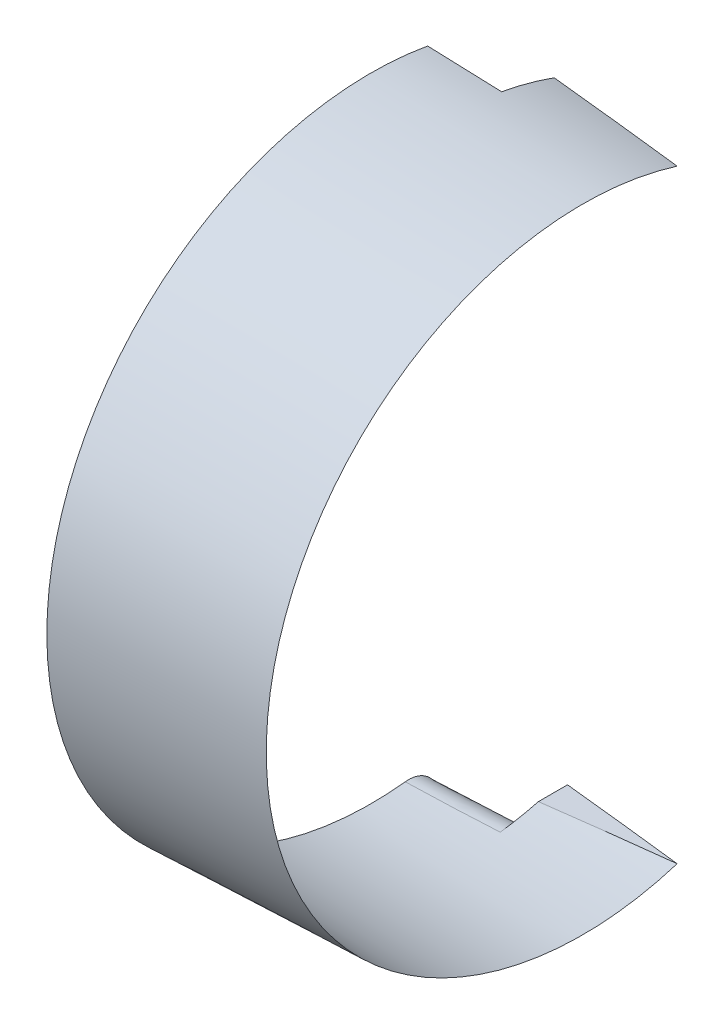
ISO-10303-21;
HEADER;
FILE_DESCRIPTION(('STEP AP214'),'2;1');
FILE_NAME('part.step','',(''),(''),'','','');
FILE_SCHEMA(('AUTOMOTIVE_DESIGN { 1 0 10303 214 1 1 1 1 }'));
ENDSEC;
DATA;
#1=APPLICATION_CONTEXT('core data for automotive mechanical design processes');
#2=APPLICATION_PROTOCOL_DEFINITION('international standard','automotive_design',2000,#1);
#3=PRODUCT_CONTEXT('',#1,'mechanical');
#4=PRODUCT('Part','Part','',(#3));
#5=PRODUCT_RELATED_PRODUCT_CATEGORY('part','',(#4));
#6=PRODUCT_DEFINITION_FORMATION('','',#4);
#7=PRODUCT_DEFINITION_CONTEXT('part definition',#1,'design');
#8=PRODUCT_DEFINITION('design','',#6,#7);
#9=PRODUCT_DEFINITION_SHAPE('','',#8);
#10=(LENGTH_UNIT() NAMED_UNIT(*) SI_UNIT(.MILLI.,.METRE.));
#11=(NAMED_UNIT(*) PLANE_ANGLE_UNIT() SI_UNIT($,.RADIAN.));
#12=(NAMED_UNIT(*) SI_UNIT($,.STERADIAN.) SOLID_ANGLE_UNIT());
#13=UNCERTAINTY_MEASURE_WITH_UNIT(LENGTH_MEASURE(1.E-05),#10,'distance_accuracy_value','');
#14=(GEOMETRIC_REPRESENTATION_CONTEXT(3) GLOBAL_UNCERTAINTY_ASSIGNED_CONTEXT((#13)) GLOBAL_UNIT_ASSIGNED_CONTEXT((#10,
#11,#12)) REPRESENTATION_CONTEXT('',''));
#15=CARTESIAN_POINT('',(0.,0.,0.));
#16=DIRECTION('',(0.,0.,1.));
#17=DIRECTION('',(1.,0.,0.));
#18=AXIS2_PLACEMENT_3D('',#15,#16,#17);
#19=CARTESIAN_POINT('',(-30.4,170.25,10.));
#20=DIRECTION('',(1.,0.,0.));
#21=DIRECTION('',(0.,0.,-1.));
#22=AXIS2_PLACEMENT_3D('',#19,#20,#21);
#23=PLANE('',#22);
#24=CARTESIAN_POINT('',(-30.4,170.25,10.));
#25=DIRECTION('',(1.,0.,0.));
#26=DIRECTION('',(0.,0.,1.));
#27=AXIS2_PLACEMENT_3D('',#24,#25,#26);
#28=CIRCLE('',#27,21.8730192372937);
#29=CARTESIAN_POINT('',(-30.4,191.782634589641,6.15622344769881));
#30=VERTEX_POINT('',#29);
#31=CARTESIAN_POINT('',(-30.4,148.76809032401,5.88216959703025));
#32=VERTEX_POINT('',#31);
#33=EDGE_CURVE('E88',#30,#32,#28,.T.);
#34=ORIENTED_EDGE('',*,*,#33,.F.);
#35=DIRECTION('',(0.,-1.,1.66037818414903E-13));
#36=VECTOR('',#35,1.);
#37=CARTESIAN_POINT('',(-30.4,193.05,6.1562234476986));
#38=LINE('',#37,#36);
#39=CARTESIAN_POINT('',(-30.4,190.76605015339,6.15622344769898));
#40=VERTEX_POINT('',#39);
#41=EDGE_CURVE('E96',#30,#40,#38,.T.);
#42=ORIENTED_EDGE('',*,*,#41,.T.);
#43=CARTESIAN_POINT('',(-30.4,170.25,10.));
#44=DIRECTION('',(-1.,0.,0.));
#45=DIRECTION('',(0.,0.,-1.));
#46=AXIS2_PLACEMENT_3D('',#43,#44,#45);
#47=CIRCLE('',#46,20.8730192372937);
#48=CARTESIAN_POINT('',(-30.4,149.507146212334,7.67256604305121));
#49=VERTEX_POINT('',#48);
#50=EDGE_CURVE('E108',#40,#49,#47,.F.);
#51=ORIENTED_EDGE('',*,*,#50,.T.);
#52=CARTESIAN_POINT('',(-35.1580639980427,149.6491063401,7.90777717509679));
#53=CARTESIAN_POINT('',(-35.2156799137428,149.788160837243,6.55850174038444));
#54=CARTESIAN_POINT('',(-35.2809816004144,148.584928754612,5.93306733864176));
#55=CARTESIAN_POINT('',(-34.5237847408734,149.629558908741,7.88105479625842));
#56=CARTESIAN_POINT('',(-34.5874994506828,149.767014456978,6.56544779082468));
#57=CARTESIAN_POINT('',(-34.6480946916069,148.608653663823,5.92647455663651));
#58=CARTESIAN_POINT('',(-33.8895799767252,149.610225316154,7.85264647986084));
#59=CARTESIAN_POINT('',(-33.9542630724782,149.745937689544,6.57036802592357));
#60=CARTESIAN_POINT('',(-34.0152556415632,148.63238581256,5.91987976287992));
#61=CARTESIAN_POINT('',(-32.6213511889419,149.572076322533,7.79207297152526));
#62=CARTESIAN_POINT('',(-32.6880980547652,149.704318606522,6.57585912091874));
#63=CARTESIAN_POINT('',(-32.7496968528884,148.679863691206,5.90668640137108));
#64=CARTESIAN_POINT('',(-31.9873271703355,149.553260934744,7.75990768367231));
#65=CARTESIAN_POINT('',(-32.054902437266,149.683759857535,6.57649464052017));
#66=CARTESIAN_POINT('',(-32.1169771177165,148.703609421447,5.90008783352674));
#67=CARTESIAN_POINT('',(-30.7196902836956,149.516244727201,7.69144553667454));
#68=CARTESIAN_POINT('',(-30.7890572232617,149.643213098873,6.5733547365916));
#69=CARTESIAN_POINT('',(-30.8518788033661,148.751106123961,5.88688924115863));
#70=CARTESIAN_POINT('',(-30.0860773514408,149.498043747556,7.65514976335643));
#71=CARTESIAN_POINT('',(-30.1561642848294,149.623209446235,6.56964130222848));
#72=CARTESIAN_POINT('',(-30.2195001782344,148.774857093227,5.88028921747081));
#73=CARTESIAN_POINT('',(-28.8191766328052,149.462384203628,7.57783900375499));
#74=CARTESIAN_POINT('',(-28.890822131952,149.583827459632,6.55759962654935));
#75=CARTESIAN_POINT('',(-28.9549857028083,148.822367939212,5.86708669485291));
#76=CARTESIAN_POINT('',(-28.1858888432557,149.44492563197,7.53682406437588));
#77=CARTESIAN_POINT('',(-28.2581457168726,149.564433920545,6.54933066191965));
#78=CARTESIAN_POINT('',(-28.3228498501636,148.846127815841,5.8604841959481));
#79=CARTESIAN_POINT('',(-26.8882348003006,149.410085602469,7.44709841843797));
#80=CARTESIAN_POINT('',(-26.9622679887698,149.525427065125,6.52730380598504));
#81=CARTESIAN_POINT('',(-27.0274562354324,148.894835794832,5.84694900875101));
#82=CARTESIAN_POINT('',(-26.2238899976702,149.39275120218,7.39810634191233));
#83=CARTESIAN_POINT('',(-26.2984390755207,149.505820483017,6.51335305476467));
#84=CARTESIAN_POINT('',(-26.3642149107087,148.919784197709,5.84001623695035));
#85=CARTESIAN_POINT('',(-25.2278354638509,149.367752523261,7.31896973555718));
#86=CARTESIAN_POINT('',(-25.3000426915673,149.477038049908,6.48770379762147));
#87=CARTESIAN_POINT('',(-25.3697108742918,148.957208200431,5.82961669065429));
#88=CARTESIAN_POINT('',(-24.8958720190964,149.359586266819,7.29164741778525));
#89=CARTESIAN_POINT('',(-24.9683449738582,149.467590737138,6.47842125997502));
#90=CARTESIAN_POINT('',(-25.0382468389186,148.969683942728,5.82614987657351));
#91=CARTESIAN_POINT('',(-24.2321507052048,149.343649857605,7.23484398062451));
#92=CARTESIAN_POINT('',(-24.3051502925843,149.448967589032,6.45817384005387));
#93=CARTESIAN_POINT('',(-24.3754838929312,148.99463416338,5.81921659964176));
#94=CARTESIAN_POINT('',(-23.90039283891,149.335879710193,7.2053628320317));
#95=CARTESIAN_POINT('',(-23.9736247959083,149.43978929041,6.44721864310385));
#96=CARTESIAN_POINT('',(-24.0441849846119,149.007108641716,5.81575013679617));
#97=CARTESIAN_POINT('',(-23.5687604403854,149.328338394709,7.17466430722613));
#98=CARTESIAN_POINT('',(-23.6411997201521,149.430735279185,6.43531556588234));
#99=CARTESIAN_POINT('',(-23.7129885556421,149.019581734774,5.81228405889741));
#100=(BOUNDED_SURFACE() B_SPLINE_SURFACE(3,2,((#52,#53,#54),(#55,#56,#57),(#58,#59,#60),(#61,
#62,#63),(#64,#65,#66),(#67,#68,#69),(#70,#71,#72),(#73,#74,#75),(#76,#77,#78),(#79,#80,#81),
(#82,#83,#84),(#85,#86,#87),(#88,#89,#90),(#91,#92,#93),(#94,#95,#96),(#97,#98,#99)),
.UNSPECIFIED.,.F.,.F.,.F.) B_SPLINE_SURFACE_WITH_KNOTS((4,2,2,2,2,2,2,4),(3,3),(0.,
1.90571918967408,3.8114870427278,5.71675505764458,7.62200413756297,9.62204994771057,
10.6222078023356,11.6223791892886),(0.,1.),
.UNSPECIFIED.) GEOMETRIC_REPRESENTATION_ITEM() RATIONAL_B_SPLINE_SURFACE(((1.,0.827379244250776,
1.),(1.,0.833845700558867,1.),(1.,0.840217705577001,1.),(1.,0.852784134376111,1.),(1.,
0.858978553618317,1.),(1.,0.871199200296149,1.),(1.,0.877225471418427,1.),(1.,0.889121306191974,
1.),(1.,0.894990871400044,1.),(1.,0.906870030276326,1.),(1.,0.912872060352,1.),(1.,
0.921759461394651,1.),(1.,0.924702849055032,1.),(1.,0.930551349853959,1.),(1.,0.933456462474104,
1.),(1.,0.936342606354415,1.))) REPRESENTATION_ITEM('') SURFACE());
#101=CARTESIAN_POINT('',(-30.4,148.76809032401,5.88216959703025));
#102=CARTESIAN_POINT('',(-30.4,148.812180430618,5.91755228924468));
#103=CARTESIAN_POINT('',(-30.4,148.854755146266,5.95478004241824));
#104=CARTESIAN_POINT('',(-30.4,148.936616541938,6.03268698333387));
#105=CARTESIAN_POINT('',(-30.4,148.975903358512,6.07336602759837));
#106=CARTESIAN_POINT('',(-30.4,149.08827219552,6.20002471887063));
#107=CARTESIAN_POINT('',(-30.4,149.156075642207,6.29079726591634));
#108=CARTESIAN_POINT('',(-30.4,149.275497352648,6.48246244023975));
#109=CARTESIAN_POINT('',(-30.4,149.327103364908,6.58336265216421));
#110=CARTESIAN_POINT('',(-30.4,149.412670929775,6.79238334433853));
#111=CARTESIAN_POINT('',(-30.4,149.446633277744,6.9005034988711));
#112=CARTESIAN_POINT('',(-30.4,149.495470778788,7.1189742737662));
#113=CARTESIAN_POINT('',(-30.4,149.51067839073,7.22924975142673));
#114=CARTESIAN_POINT('',(-30.4,149.519713832097,7.39538291059224));
#115=CARTESIAN_POINT('',(-30.4,149.520422693815,7.45094325872433));
#116=CARTESIAN_POINT('',(-30.4,149.517235752087,7.56193507232413));
#117=CARTESIAN_POINT('',(-30.4,149.513339673379,7.61736652988895));
#118=CARTESIAN_POINT('',(-30.4,149.507146212334,7.67256604305121));
#119=B_SPLINE_CURVE_WITH_KNOTS('',3,(#101,#102,#103,#104,#105,#106,#107,#108,#109,#110,#111,
#112,#113,#114,#115,#116,#117,#118),.UNSPECIFIED.,.F.,.F.,(4,2,2,2,2,2,2,2,4),(0.,
0.16949195160629,0.338976860517195,0.677136938528227,1.01555218271773,1.35395217009212,
1.68626298146878,1.85279186417179,2.01933070165036),.UNSPECIFIED.);
#120=EDGE_CURVE('E106',#32,#49,#119,.T.);
#121=ORIENTED_EDGE('',*,*,#120,.F.);
#122=EDGE_LOOP('',(#34,#42,#51,#121));
#123=FACE_BOUND('',#122,.T.);
#124=ADVANCED_FACE('F17',(#123),#23,.F.);
#125=CARTESIAN_POINT('',(-25.,190.65,757.817890449207));
#126=DIRECTION('',(0.,1.,0.));
#127=DIRECTION('',(0.,0.,-1.));
#128=AXIS2_PLACEMENT_3D('',#125,#126,#127);
#129=PLANE('',#128);
#130=DIRECTION('',(0.,0.,-1.));
#131=VECTOR('',#130,1.);
#132=CARTESIAN_POINT('',(-25.4,190.65,757.817890449207));
#133=LINE('',#132,#131);
#134=CARTESIAN_POINT('',(-25.4,190.65,4.81903121821762));
#135=VERTEX_POINT('',#134);
#136=CARTESIAN_POINT('',(-25.4,190.65,2.60667663159342));
#137=VERTEX_POINT('',#136);
#138=EDGE_CURVE('E137',#135,#137,#133,.T.);
#139=ORIENTED_EDGE('',*,*,#138,.T.);
#140=CARTESIAN_POINT('',(-62.8082811067893,190.65,-0.632879414674593));
#141=CARTESIAN_POINT('',(-61.3386385128492,190.65,-0.521838131036973));
#142=CARTESIAN_POINT('',(-59.869097676116,190.65,-0.409449074674919));
#143=CARTESIAN_POINT('',(-56.9302474357948,190.65,-0.18167268701923));
#144=CARTESIAN_POINT('',(-55.4609380323724,190.65,-0.0662853535906007));
#145=CARTESIAN_POINT('',(-51.053815742654,190.65,0.2847949569871));
#146=CARTESIAN_POINT('',(-48.1163948766174,190.65,0.525437345784025));
#147=CARTESIAN_POINT('',(-42.2456558523834,190.65,1.02294366032289));
#148=CARTESIAN_POINT('',(-39.3123364138391,190.65,1.27979235866845));
#149=CARTESIAN_POINT('',(-34.9136102399035,190.65,1.68109526654585));
#150=CARTESIAN_POINT('',(-33.4474727149579,190.65,1.81754482732303));
#151=CARTESIAN_POINT('',(-30.5157755952489,190.65,2.09666245593361));
#152=CARTESIAN_POINT('',(-29.0502160054168,190.65,2.23933057571735));
#153=CARTESIAN_POINT('',(-26.1176709337122,190.65,2.53218223708271));
#154=CARTESIAN_POINT('',(-24.650686521203,190.65,2.68237651434194));
#155=CARTESIAN_POINT('',(-21.717678932816,190.65,2.99152759042302));
#156=CARTESIAN_POINT('',(-20.2516557311842,190.65,3.15048414388201));
#157=CARTESIAN_POINT('',(-17.3213387654425,190.65,3.4790812854021));
#158=CARTESIAN_POINT('',(-15.857044568226,190.65,3.64871799849608));
#159=CARTESIAN_POINT('',(-12.9299237830079,190.65,4.00152449878683));
#160=CARTESIAN_POINT('',(-11.4670973542034,190.65,4.18469562065548));
#161=CARTESIAN_POINT('',(-9.27370509401195,190.65,4.47295021685582));
#162=CARTESIAN_POINT('',(-8.54226032736779,190.65,4.57135022665871));
#163=CARTESIAN_POINT('',(-7.08010714679224,190.65,4.7734151606506));
#164=CARTESIAN_POINT('',(-6.34939872168463,190.65,4.87708000366372));
#165=CARTESIAN_POINT('',(-4.88910004395575,190.65,5.09064694973913));
#166=CARTESIAN_POINT('',(-4.15950953541669,190.65,5.20054729720178));
#167=CARTESIAN_POINT('',(-2.70147090297682,190.65,5.42798435006328));
#168=CARTESIAN_POINT('',(-1.97302284574464,190.65,5.54552148528854));
#169=CARTESIAN_POINT('',(-0.516769503285837,190.65,5.7903275253578));
#170=CARTESIAN_POINT('',(0.211033668998,190.65,5.91760905383816));
#171=CARTESIAN_POINT('',(1.66427328905573,190.65,6.18461411370408));
#172=CARTESIAN_POINT('',(2.38971008100049,190.65,6.32433574372698));
#173=CARTESIAN_POINT('',(3.47557792907779,190.65,6.54691410495799));
#174=CARTESIAN_POINT('',(3.8373311928785,190.65,6.62331392739027));
#175=CARTESIAN_POINT('',(4.55966621000204,190.65,6.78138533566997));
#176=CARTESIAN_POINT('',(4.92024802927615,190.65,6.86305661914088));
#177=CARTESIAN_POINT('',(5.64008586490631,190.65,7.03291398892278));
#178=CARTESIAN_POINT('',(5.99934111267151,190.65,7.12110337139022));
#179=CARTESIAN_POINT('',(6.7157046170183,190.65,7.30605389981151));
#180=CARTESIAN_POINT('',(7.07281243790749,190.65,7.40281672647657));
#181=CARTESIAN_POINT('',(7.42845753958506,190.65,7.50489636178006));
#182=B_SPLINE_CURVE_WITH_KNOTS('',3,(#140,#141,#142,#143,#144,#145,#146,#147,#148,#149,#150,
#151,#152,#153,#154,#155,#156,#157,#158,#159,#160,#161,#162,#163,#164,#165,#166,#167,#168,#169,
#170,#171,#172,#173,#174,#175,#176,#177,#178,#179,#180,#181),.UNSPECIFIED.,.F.,.F.,(4,2,2,2,2,2,
2,2,2,2,2,2,2,2,2,2,2,2,2,2,4),(0.,4.42149392257532,8.8429909936661,17.6847399449881,
26.5183014855311,30.9357110578034,35.3531575405593,39.7770953657568,44.2009093738987,
48.6231274850162,53.045782268892,55.2598690348606,57.4739216732695,59.6873540113512,
61.9009110376157,64.1173858469945,66.3335224668844,67.4426896258096,68.5517932181928,
69.6614615652571,70.771347931592),.UNSPECIFIED.);
#183=CARTESIAN_POINT('',(-16.0818800189067,190.650000443993,3.62458368396145));
#184=VERTEX_POINT('',#183);
#185=EDGE_CURVE('E120',#137,#184,#182,.T.);
#186=ORIENTED_EDGE('',*,*,#185,.T.);
#187=CARTESIAN_POINT('',(10.1181525308279,190.65,1.02266959439106));
#188=CARTESIAN_POINT('',(9.34778439153069,190.65,1.08946034541119));
#189=CARTESIAN_POINT('',(8.57746954508265,190.65,1.15686744882721));
#190=CARTESIAN_POINT('',(7.03655691914136,190.65,1.29304433133244));
#191=CARTESIAN_POINT('',(6.26595920063214,190.65,1.36181480032713));
#192=CARTESIAN_POINT('',(4.72112752575067,190.65,1.50111862239613));
#193=CARTESIAN_POINT('',(3.94689419726085,190.65,1.57165894662262));
#194=CARTESIAN_POINT('',(2.39896913756692,190.65,1.71425317198982));
#195=CARTESIAN_POINT('',(1.62527733275723,190.65,1.78630627510938));
#196=CARTESIAN_POINT('',(-0.919259386082226,190.65,2.02604357221745));
#197=CARTESIAN_POINT('',(-2.68977328594326,190.65,2.19726438579481));
#198=CARTESIAN_POINT('',(-6.22999124363841,190.65,2.55031336395147));
#199=CARTESIAN_POINT('',(-7.99969515812252,190.65,2.73214297175663));
#200=CARTESIAN_POINT('',(-11.5439661235383,190.65,3.10965629530979));
#201=CARTESIAN_POINT('',(-13.3185282124932,190.65,3.30538677640734));
#202=CARTESIAN_POINT('',(-16.8646995117104,190.65,3.71380712456859));
#203=CARTESIAN_POINT('',(-18.6363098284841,190.65,3.92648726256095));
#204=CARTESIAN_POINT('',(-21.2851643048272,190.65,4.26212343026073));
#205=CARTESIAN_POINT('',(-22.1635175916068,190.65,4.37632743371009));
#206=CARTESIAN_POINT('',(-23.9193628685315,190.65,4.61162458040365));
#207=CARTESIAN_POINT('',(-24.7968547994827,190.65,4.73271816742528));
#208=CARTESIAN_POINT('',(-26.5525180507052,190.65,4.98355858672839));
#209=CARTESIAN_POINT('',(-27.4306868198942,190.65,5.11332334641799));
#210=CARTESIAN_POINT('',(-29.1852141375444,190.65,5.38339996284615));
#211=CARTESIAN_POINT('',(-30.0615730461403,190.65,5.52370946018645));
#212=CARTESIAN_POINT('',(-31.8046538382217,190.65,5.81693623526627));
#213=CARTESIAN_POINT('',(-32.6713950205198,190.65,5.96973825113041));
#214=CARTESIAN_POINT('',(-34.4021883194008,190.65,6.29408587740216));
#215=CARTESIAN_POINT('',(-35.2662376261856,190.65,6.46564685352738));
#216=CARTESIAN_POINT('',(-36.5561028083285,190.65,6.74378491100842));
#217=CARTESIAN_POINT('',(-36.9841998012542,190.65,6.83975780562557));
#218=CARTESIAN_POINT('',(-37.8383817269235,190.65,7.04083295951572));
#219=CARTESIAN_POINT('',(-38.2644661493874,190.65,7.14593741547534));
#220=CARTESIAN_POINT('',(-39.1128058011184,190.65,7.36826058022714));
#221=CARTESIAN_POINT('',(-39.5350657276098,190.65,7.48546130677287));
#222=CARTESIAN_POINT('',(-40.3743013617468,190.65,7.73734074077072));
#223=CARTESIAN_POINT('',(-40.7912799058827,190.65,7.87200958811293));
#224=CARTESIAN_POINT('',(-41.2868839092547,190.65,8.0513085907383));
#225=CARTESIAN_POINT('',(-41.370470100203,190.65,8.08221853787228));
#226=CARTESIAN_POINT('',(-41.5371244693648,190.65,8.14542621503385));
#227=CARTESIAN_POINT('',(-41.6201925932989,190.65,8.17772408777127));
#228=CARTESIAN_POINT('',(-41.8686229908223,190.65,8.27700975395232));
#229=CARTESIAN_POINT('',(-42.0330691409135,190.65,8.34633888419922));
#230=CARTESIAN_POINT('',(-42.3573379458009,190.65,8.4929654090665));
#231=CARTESIAN_POINT('',(-42.5171805224506,190.65,8.57021851368726));
#232=CARTESIAN_POINT('',(-42.8306602160068,190.65,8.73632645703956));
#233=CARTESIAN_POINT('',(-42.9843070441684,190.65,8.82516213580737));
#234=CARTESIAN_POINT('',(-43.2196336345816,190.65,8.98110801214523));
#235=CARTESIAN_POINT('',(-43.3051630078076,190.65,9.04235490475169));
#236=CARTESIAN_POINT('',(-43.4693973045478,190.65,9.17359177784879));
#237=CARTESIAN_POINT('',(-43.548109933499,190.65,9.24357166241894));
#238=CARTESIAN_POINT('',(-43.6632389521219,190.65,9.36421557698408));
#239=CARTESIAN_POINT('',(-43.7037187613086,190.65,9.41095629577337));
#240=CARTESIAN_POINT('',(-43.7782641498711,190.65,9.509365526883));
#241=CARTESIAN_POINT('',(-43.8123384541942,190.65,9.56102718962684));
#242=CARTESIAN_POINT('',(-43.8635730121918,190.65,9.65593938355105));
#243=CARTESIAN_POINT('',(-43.8828318853962,190.65,9.69803855783283));
#244=CARTESIAN_POINT('',(-43.9143076657574,190.65,9.78479425674002));
#245=CARTESIAN_POINT('',(-43.9265360851591,190.65,9.82944646820247));
#246=CARTESIAN_POINT('',(-43.9425592849577,190.65,9.92073128591668));
#247=CARTESIAN_POINT('',(-43.946273067782,190.65,9.96737864655458));
#248=CARTESIAN_POINT('',(-43.9444515545431,190.65,10.0604999260674));
#249=CARTESIAN_POINT('',(-43.9389141855011,190.65,10.1069738037298));
#250=CARTESIAN_POINT('',(-43.9206752025029,190.65,10.1922420324433));
#251=CARTESIAN_POINT('',(-43.9089754005753,190.65,10.2312608311549));
#252=CARTESIAN_POINT('',(-43.8802553308426,190.65,10.3072558523469));
#253=CARTESIAN_POINT('',(-43.8632333678806,190.65,10.3442314196179));
#254=CARTESIAN_POINT('',(-43.8099084619183,190.65,10.4442198251817));
#255=CARTESIAN_POINT('',(-43.7689908235019,190.65,10.504751745004));
#256=CARTESIAN_POINT('',(-43.678760252456,190.65,10.6192079685067));
#257=CARTESIAN_POINT('',(-43.6294157251221,190.65,10.6731060412535));
#258=CARTESIAN_POINT('',(-43.5066854201197,190.65,10.7939132917044));
#259=CARTESIAN_POINT('',(-43.4310480190042,190.65,10.8585029452347));
#260=CARTESIAN_POINT('',(-43.2739753973514,190.65,10.9802980532575));
#261=CARTESIAN_POINT('',(-43.1925279314711,190.65,11.0374871515217));
#262=CARTESIAN_POINT('',(-42.9420123854848,190.65,11.2012635334481));
#263=CARTESIAN_POINT('',(-42.7674978657285,190.65,11.2994337761119));
#264=CARTESIAN_POINT('',(-42.4049712792693,190.65,11.4854454532404));
#265=CARTESIAN_POINT('',(-42.2166982833049,190.65,11.5727508779499));
#266=CARTESIAN_POINT('',(-41.8357348245321,190.65,11.737247704599));
#267=CARTESIAN_POINT('',(-41.6430427230958,190.65,11.8144352811388));
#268=CARTESIAN_POINT('',(-41.0599386336693,190.65,12.0354884580575));
#269=CARTESIAN_POINT('',(-40.6654288230063,190.65,12.1684102389868));
#270=CARTESIAN_POINT('',(-39.8706425455229,190.65,12.4167924201908));
#271=CARTESIAN_POINT('',(-39.4703597763415,190.65,12.5322318579584));
#272=CARTESIAN_POINT('',(-38.6670873958008,190.65,12.7506735932054));
#273=CARTESIAN_POINT('',(-38.2641028233713,190.65,12.853694527553));
#274=CARTESIAN_POINT('',(-37.4601783376116,190.65,13.0496941929844));
#275=CARTESIAN_POINT('',(-37.0592609608059,190.65,13.142766486502));
#276=CARTESIAN_POINT('',(-36.255882610136,190.65,13.322021491904));
#277=CARTESIAN_POINT('',(-35.8534215814388,190.65,13.4082039566302));
#278=CARTESIAN_POINT('',(-34.6442022024362,190.65,13.6585415883151));
#279=CARTESIAN_POINT('',(-33.8357410429888,190.65,13.8144555432839));
#280=CARTESIAN_POINT('',(-32.2151148259625,190.65,14.111193646942));
#281=CARTESIAN_POINT('',(-31.402946513299,190.65,14.2519996846615));
#282=CARTESIAN_POINT('',(-29.7767859639217,190.65,14.5220959044479));
#283=CARTESIAN_POINT('',(-28.9627939085515,190.65,14.6513871835528));
#284=CARTESIAN_POINT('',(-27.334976817698,190.65,14.9007424626544));
#285=CARTESIAN_POINT('',(-26.5211543589791,190.65,15.020823394562));
#286=CARTESIAN_POINT('',(-24.8924555240898,190.65,15.2537178699879));
#287=CARTESIAN_POINT('',(-24.0775791237586,190.65,15.3665312437787));
#288=CARTESIAN_POINT('',(-21.6326018952729,190.65,15.6958761386299));
#289=CARTESIAN_POINT('',(-20.0012935943197,190.65,15.9034410745902));
#290=CARTESIAN_POINT('',(-16.7702116057473,190.65,16.2971119063462));
#291=CARTESIAN_POINT('',(-15.1704804492335,190.65,16.483571733466));
#292=CARTESIAN_POINT('',(-11.9693522104545,190.65,16.8435893992576));
#293=CARTESIAN_POINT('',(-10.3679549315464,190.65,17.017145483327));
#294=CARTESIAN_POINT('',(-7.16396915585725,190.65,17.3539171655097));
#295=CARTESIAN_POINT('',(-5.5613805856288,190.65,17.5171320612698));
#296=CARTESIAN_POINT('',(-2.35541881956578,190.65,17.8350264494596));
#297=CARTESIAN_POINT('',(-0.752045654624625,190.65,17.9897062543438));
#298=CARTESIAN_POINT('',(2.39560166565168,190.65,18.2862752698416));
#299=CARTESIAN_POINT('',(3.93985123584826,190.65,18.4284263282041));
#300=CARTESIAN_POINT('',(7.02871573417081,190.65,18.706970144653));
#301=CARTESIAN_POINT('',(8.57333061085536,190.65,18.8433634725769));
#302=CARTESIAN_POINT('',(10.1181525308279,190.65,18.9773304056089));
#303=B_SPLINE_CURVE_WITH_KNOTS('',3,(#187,#188,#189,#190,#191,#192,#193,#194,#195,#196,#197,
#198,#199,#200,#201,#202,#203,#204,#205,#206,#207,#208,#209,#210,#211,#212,#213,#214,#215,#216,
#217,#218,#219,#220,#221,#222,#223,#224,#225,#226,#227,#228,#229,#230,#231,#232,#233,#234,#235,
#236,#237,#238,#239,#240,#241,#242,#243,#244,#245,#246,#247,#248,#249,#250,#251,#252,#253,#254,
#255,#256,#257,#258,#259,#260,#261,#262,#263,#264,#265,#266,#267,#268,#269,#270,#271,#272,#273,
#274,#275,#276,#277,#278,#279,#280,#281,#282,#283,#284,#285,#286,#287,#288,#289,#290,#291,#292,
#293,#294,#295,#296,#297,#298,#299,#300,#301,#302),.UNSPECIFIED.,.F.,.F.,(4,2,2,2,2,2,2,2,2,2,2,
2,2,2,2,2,2,2,2,2,2,2,2,2,2,2,2,2,2,2,2,2,2,2,2,2,2,2,2,2,2,2,2,2,2,2,2,2,2,2,2,2,2,2,2,2,2,4),
(0.,2.31977422016381,4.64075389918069,6.97307273110424,9.30419068351168,14.6404846714751,
19.9775063120302,25.3334211889887,30.6862836219685,33.3435026757531,36.0008930826752,
38.6639585536399,41.3264299243155,43.9666333032217,46.6090157427176,47.9251180731346,
49.241537886169,50.5560281598812,51.8697796551636,52.137123230785,52.4044943613966,
52.9396891753207,53.4720406473412,54.0035224156819,54.3187958419287,54.6337081101516,
54.8188537157353,55.0037452773881,55.1421467115918,55.2803208656159,55.4198040767016,
55.5593185470862,55.6810717029798,55.8028636779384,56.0207731059365,56.2395182310446,
56.5371668235697,56.8354624152541,57.4349039162695,58.0571833729559,58.6796974292739,
59.9277948449059,61.177377161834,62.4250602039751,63.6597252683003,64.8944346038074,
67.3642645288266,69.8370228975422,72.309545428201,74.7774078505458,77.2453278867857,
82.1785611918842,87.0101861898928,91.8424669770472,96.6750756122064,101.507507216662,
106.159831289212,110.811693840738),.UNSPECIFIED.);
#304=EDGE_CURVE('E133',#184,#135,#303,.T.);
#305=ORIENTED_EDGE('',*,*,#304,.T.);
#306=EDGE_LOOP('',(#139,#186,#305));
#307=FACE_BOUND('',#306,.T.);
#308=ADVANCED_FACE('F192',(#307),#129,.F.);
#309=CARTESIAN_POINT('',(-30.4,170.25,10.));
#310=DIRECTION('',(-1.,0.,0.));
#311=DIRECTION('',(0.,0.,1.));
#312=AXIS2_PLACEMENT_3D('',#309,#310,#311);
#313=CONICAL_SURFACE('',#312,21.8730192372937,0.0349065850398866);
#314=ORIENTED_EDGE('',*,*,#33,.T.);
#315=CARTESIAN_POINT('',(-24.3998,148.993709267679,5.8194736137228));
#316=CARTESIAN_POINT('',(-25.3998648441575,148.956059864328,5.82993579533581));
#317=CARTESIAN_POINT('',(-26.3999305995709,148.918432958062,5.8403917253602));
#318=CARTESIAN_POINT('',(-28.4000639329042,148.843224139698,5.86129108223173));
#319=CARTESIAN_POINT('',(-29.4001315108242,148.805642227601,5.87173450907886));
#320=CARTESIAN_POINT('',(-30.4002,148.768082812587,5.88217168433738));
#321=B_SPLINE_CURVE_WITH_KNOTS('',3,(#315,#316,#317,#318,#319,#320),.UNSPECIFIED.,.F.,.F.,(4,2,
4),(0.,3.00248391024591,6.00496782047607),.UNSPECIFIED.);
#322=CARTESIAN_POINT('',(-24.4,148.993701738232,5.81947570603851));
#323=VERTEX_POINT('',#322);
#324=EDGE_CURVE('E124',#323,#32,#321,.T.);
#325=ORIENTED_EDGE('',*,*,#324,.F.);
#326=CARTESIAN_POINT('',(-24.4,170.25,10.));
#327=DIRECTION('',(-1.,0.,0.));
#328=DIRECTION('',(0.,0.,-1.));
#329=AXIS2_PLACEMENT_3D('',#326,#327,#328);
#330=CIRCLE('',#329,21.6634946203432);
#331=CARTESIAN_POINT('',(-24.4,149.85,2.70980115733191));
#332=VERTEX_POINT('',#331);
#333=EDGE_CURVE('E245',#332,#323,#330,.T.);
#334=ORIENTED_EDGE('',*,*,#333,.F.);
#335=CARTESIAN_POINT('',(7.42845753958506,149.85,7.50489636178011));
#336=CARTESIAN_POINT('',(7.07281243790746,149.85,7.40281672647674));
#337=CARTESIAN_POINT('',(6.71570461701826,149.85,7.30605389981171));
#338=CARTESIAN_POINT('',(5.99934111267147,149.85,7.12110337139043));
#339=CARTESIAN_POINT('',(5.64008586490628,149.85,7.03291398892295));
#340=CARTESIAN_POINT('',(4.92024802927613,149.85,6.86305661914103));
#341=CARTESIAN_POINT('',(4.55966621000202,149.85,6.78138533567013));
#342=CARTESIAN_POINT('',(3.83733119287848,149.85,6.62331392739044));
#343=CARTESIAN_POINT('',(3.47557792907777,149.85,6.54691410495815));
#344=CARTESIAN_POINT('',(2.38971008100047,149.85,6.32433574372714));
#345=CARTESIAN_POINT('',(1.66427328905572,149.85,6.18461411370422));
#346=CARTESIAN_POINT('',(0.211033668997989,149.85,5.91760905383829));
#347=CARTESIAN_POINT('',(-0.516769503285847,149.85,5.79032752535793));
#348=CARTESIAN_POINT('',(-1.97302284574465,149.85,5.54552148528868));
#349=CARTESIAN_POINT('',(-2.70147090297683,149.85,5.42798435006341));
#350=CARTESIAN_POINT('',(-4.15950953541669,149.85,5.20054729720189));
#351=CARTESIAN_POINT('',(-4.88910004395574,149.85,5.09064694973924));
#352=CARTESIAN_POINT('',(-6.34939872168462,149.85,4.87708000366384));
#353=CARTESIAN_POINT('',(-7.08010714679223,149.85,4.77341516065072));
#354=CARTESIAN_POINT('',(-8.54226032736777,149.85,4.57135022665882));
#355=CARTESIAN_POINT('',(-9.27370509401193,149.85,4.47295021685592));
#356=CARTESIAN_POINT('',(-11.4670973542033,149.85,4.18469562065558));
#357=CARTESIAN_POINT('',(-12.9299237830079,149.85,4.00152449878692));
#358=CARTESIAN_POINT('',(-15.857044568226,149.85,3.64871799849618));
#359=CARTESIAN_POINT('',(-17.3213387654425,149.85,3.47908128540222));
#360=CARTESIAN_POINT('',(-20.2516557311842,149.85,3.15048414388207));
#361=CARTESIAN_POINT('',(-21.7176789328159,149.85,2.99152759042301));
#362=CARTESIAN_POINT('',(-24.6506865212029,149.85,2.68237651434211));
#363=CARTESIAN_POINT('',(-26.1176709337122,149.85,2.53218223708314));
#364=CARTESIAN_POINT('',(-29.0502160054168,149.85,2.23933057571778));
#365=CARTESIAN_POINT('',(-30.5157755952488,149.85,2.09666245593377));
#366=CARTESIAN_POINT('',(-33.4474727149579,149.85,1.817544827323));
#367=CARTESIAN_POINT('',(-34.9136102399035,149.85,1.68109526654589));
#368=CARTESIAN_POINT('',(-39.312336413839,149.85,1.2797923586686));
#369=CARTESIAN_POINT('',(-42.2456558523833,149.85,1.02294366032299));
#370=CARTESIAN_POINT('',(-48.1163948766173,149.85,0.525437345784073));
#371=CARTESIAN_POINT('',(-51.0538157426539,149.85,0.284794956987156));
#372=CARTESIAN_POINT('',(-55.4609380323723,149.85,-0.0662853535905377));
#373=CARTESIAN_POINT('',(-56.9302474357947,149.85,-0.181672687019165));
#374=CARTESIAN_POINT('',(-59.8690976761159,149.85,-0.409449074674868));
#375=CARTESIAN_POINT('',(-61.3386385128491,149.85,-0.521838131036937));
#376=CARTESIAN_POINT('',(-62.8082811067892,149.85,-0.632879414674586));
#377=B_SPLINE_CURVE_WITH_KNOTS('',3,(#335,#336,#337,#338,#339,#340,#341,#342,#343,#344,#345,
#346,#347,#348,#349,#350,#351,#352,#353,#354,#355,#356,#357,#358,#359,#360,#361,#362,#363,#364,
#365,#366,#367,#368,#369,#370,#371,#372,#373,#374,#375,#376),.UNSPECIFIED.,.F.,.F.,(4,2,2,2,2,2,
2,2,2,2,2,2,2,2,2,2,2,2,2,2,4),(0.,1.10988636633487,2.21955471339913,3.32865830578234,
4.43782546470755,6.65396208459745,8.87043689397619,11.0839939202407,13.2974262583225,
15.5114788967313,17.7255656626999,22.1482204465757,26.5704385576932,30.9942525658351,
35.4181903910326,39.8356368737885,44.2530464460608,53.0866079866038,61.9283569379258,
66.3498540090165,70.7713479315918),.UNSPECIFIED.);
#378=CARTESIAN_POINT('',(-16.0818800189067,149.849999334011,3.62458439430303));
#379=VERTEX_POINT('',#378);
#380=EDGE_CURVE('E109',#379,#332,#377,.T.);
#381=ORIENTED_EDGE('',*,*,#380,.F.);
#382=CARTESIAN_POINT('',(-16.0818733585423,170.25,10.));
#383=DIRECTION('',(1.,0.,0.));
#384=DIRECTION('',(0.,0.,1.));
#385=AXIS2_PLACEMENT_3D('',#382,#383,#384);
#386=CIRCLE('',#385,21.3730192372937);
#387=EDGE_CURVE('E116',#184,#379,#386,.T.);
#388=ORIENTED_EDGE('',*,*,#387,.F.);
#389=ORIENTED_EDGE('',*,*,#185,.F.);
#390=CARTESIAN_POINT('',(-25.4,170.25,10.));
#391=DIRECTION('',(1.,0.,0.));
#392=DIRECTION('',(0.,0.,1.));
#393=AXIS2_PLACEMENT_3D('',#390,#391,#392);
#394=CIRCLE('',#393,21.6984153898349);
#395=CARTESIAN_POINT('',(-25.4,191.605247885375,6.15622344769884));
#396=VERTEX_POINT('',#395);
#397=EDGE_CURVE('E90',#137,#396,#394,.T.);
#398=ORIENTED_EDGE('',*,*,#397,.T.);
#399=CARTESIAN_POINT('',(-45.8202713528625,192.329425419893,6.15622344769872));
#400=CARTESIAN_POINT('',(-40.2575349457529,192.132253249335,6.15622344769875));
#401=CARTESIAN_POINT('',(-34.6948015274562,191.93499682873,6.15622344769878));
#402=CARTESIAN_POINT('',(-23.5693406684183,191.540315487426,6.15622344769884));
#403=CARTESIAN_POINT('',(-18.0066132276771,191.342890566727,6.15622344769888));
#404=CARTESIAN_POINT('',(-12.4438887757489,191.145381395982,6.15622344769891));
#405=B_SPLINE_CURVE_WITH_KNOTS('',3,(#399,#400,#401,#402,#403,#404),.UNSPECIFIED.,.F.,.F.,(4,2,
4),(0.,16.6986891283879,33.397378256987),.UNSPECIFIED.);
#406=EDGE_CURVE('E83',#30,#396,#405,.T.);
#407=ORIENTED_EDGE('',*,*,#406,.F.);
#408=EDGE_LOOP('',(#314,#325,#334,#381,#388,#389,#398,#407));
#409=FACE_BOUND('',#408,.T.);
#410=ADVANCED_FACE('F85',(#409),#313,.T.);
#411=CARTESIAN_POINT('',(-30.4,170.25,10.));
#412=DIRECTION('',(1.,0.,0.));
#413=DIRECTION('',(0.,0.,-1.));
#414=AXIS2_PLACEMENT_3D('',#411,#412,#413);
#415=CONICAL_SURFACE('',#414,20.8730192372937,0.0349065850398866);
#416=ORIENTED_EDGE('',*,*,#50,.F.);
#417=CARTESIAN_POINT('',(-44.894341895488,190.250864952127,6.15622344769906));
#418=CARTESIAN_POINT('',(-39.6464118729362,190.437475464337,6.15622344769903));
#419=CARTESIAN_POINT('',(-34.3984788096362,190.624000384888,6.156223447699));
#420=CARTESIAN_POINT('',(-23.9026066016162,190.996879042666,6.15622344769894));
#421=CARTESIAN_POINT('',(-18.6546674568961,191.183232779894,6.15622344769891));
#422=CARTESIAN_POINT('',(-13.4067252714279,191.369500925462,6.15622344769888));
#423=B_SPLINE_CURVE_WITH_KNOTS('',3,(#417,#418,#419,#420,#421,#422),.UNSPECIFIED.,.F.,.F.,(4,2,
4),(0.,15.7537404080988,31.5074808159696),.UNSPECIFIED.);
#424=CARTESIAN_POINT('',(-25.4,190.943666164645,6.15622344769895));
#425=VERTEX_POINT('',#424);
#426=EDGE_CURVE('E99',#40,#425,#423,.T.);
#427=ORIENTED_EDGE('',*,*,#426,.T.);
#428=CARTESIAN_POINT('',(-25.4,170.25,10.));
#429=DIRECTION('',(1.,0.,0.));
#430=DIRECTION('',(0.,0.,1.));
#431=AXIS2_PLACEMENT_3D('',#428,#429,#430);
#432=CIRCLE('',#431,21.0476230847524);
#433=EDGE_CURVE('E258',#135,#425,#432,.T.);
#434=ORIENTED_EDGE('',*,*,#433,.F.);
#435=ORIENTED_EDGE('',*,*,#304,.F.);
#436=ORIENTED_EDGE('',*,*,#387,.T.);
#437=CARTESIAN_POINT('',(10.1181525308279,149.85,18.9773304056089));
#438=CARTESIAN_POINT('',(9.34778439153071,149.85,18.9105396545888));
#439=CARTESIAN_POINT('',(8.57746954508267,149.85,18.8431325511727));
#440=CARTESIAN_POINT('',(7.03655691914136,149.85,18.7069556686675));
#441=CARTESIAN_POINT('',(6.26595920063215,149.85,18.6381851996728));
#442=CARTESIAN_POINT('',(4.72112752575067,149.85,18.4988813776038));
#443=CARTESIAN_POINT('',(3.94689419726085,149.85,18.4283410533773));
#444=CARTESIAN_POINT('',(2.39896913756693,149.85,18.2857468280101));
#445=CARTESIAN_POINT('',(1.62527733275723,149.85,18.2136937248906));
#446=CARTESIAN_POINT('',(-0.919259386082162,149.85,17.9739564277826));
#447=CARTESIAN_POINT('',(-2.68977328594313,149.85,17.8027356142052));
#448=CARTESIAN_POINT('',(-6.22999124363815,149.85,17.4496866360485));
#449=CARTESIAN_POINT('',(-7.9996951581222,149.85,17.2678570282433));
#450=CARTESIAN_POINT('',(-11.543966123538,149.85,16.8903437046902));
#451=CARTESIAN_POINT('',(-13.3185282124929,149.85,16.6946132235926));
#452=CARTESIAN_POINT('',(-16.8646995117101,149.85,16.2861928754313));
#453=CARTESIAN_POINT('',(-18.6363098284838,149.85,16.073512737439));
#454=CARTESIAN_POINT('',(-21.285164304827,149.85,15.7378765697392));
#455=CARTESIAN_POINT('',(-22.1635175916066,149.85,15.6236725662898));
#456=CARTESIAN_POINT('',(-23.9193628685315,149.85,15.3883754195962));
#457=CARTESIAN_POINT('',(-24.7968547994828,149.85,15.2672818325746));
#458=CARTESIAN_POINT('',(-26.5525180507054,149.85,15.0164414132715));
#459=CARTESIAN_POINT('',(-27.4306868198946,149.85,14.8866766535818));
#460=CARTESIAN_POINT('',(-29.1852141375449,149.85,14.6166000371536));
#461=CARTESIAN_POINT('',(-30.0615730461409,149.85,14.4762905398133));
#462=CARTESIAN_POINT('',(-31.8046538382223,149.85,14.1830637647335));
#463=CARTESIAN_POINT('',(-32.6713950205204,149.85,14.0302617488693));
#464=CARTESIAN_POINT('',(-34.4021883194013,149.85,13.7059141225976));
#465=CARTESIAN_POINT('',(-35.2662376261861,149.85,13.5343531464724));
#466=CARTESIAN_POINT('',(-36.556102808329,149.85,13.2562150889913));
#467=CARTESIAN_POINT('',(-36.9841998012546,149.85,13.1602421943742));
#468=CARTESIAN_POINT('',(-37.8383817269239,149.85,12.959167040484));
#469=CARTESIAN_POINT('',(-38.2644661493878,149.85,12.8540625845244));
#470=CARTESIAN_POINT('',(-39.1128058011186,149.85,12.6317394197725));
#471=CARTESIAN_POINT('',(-39.53506572761,149.85,12.5145386932267));
#472=CARTESIAN_POINT('',(-40.3743013617469,149.85,12.2626592592291));
#473=CARTESIAN_POINT('',(-40.7912799058829,149.85,12.1279904118873));
#474=CARTESIAN_POINT('',(-41.2868839092546,149.85,11.9486914092616));
#475=CARTESIAN_POINT('',(-41.3704701002029,149.85,11.9177814621275));
#476=CARTESIAN_POINT('',(-41.5371244693646,149.85,11.8545737849659));
#477=CARTESIAN_POINT('',(-41.6201925932987,149.85,11.8222759122285));
#478=CARTESIAN_POINT('',(-41.868622990822,149.85,11.7229902460475));
#479=CARTESIAN_POINT('',(-42.0330691409133,149.85,11.6536611158006));
#480=CARTESIAN_POINT('',(-42.3573379458006,149.85,11.5070345909332));
#481=CARTESIAN_POINT('',(-42.5171805224502,149.85,11.4297814863123));
#482=CARTESIAN_POINT('',(-42.8306602160065,149.85,11.2636735429603));
#483=CARTESIAN_POINT('',(-42.9843070441684,149.85,11.1748378641929));
#484=CARTESIAN_POINT('',(-43.2196336345812,149.85,11.0188919878548));
#485=CARTESIAN_POINT('',(-43.305163007807,149.85,10.957645095248));
#486=CARTESIAN_POINT('',(-43.4693973045474,149.85,10.8264082221509));
#487=CARTESIAN_POINT('',(-43.548109933499,149.85,10.7564283375811));
#488=CARTESIAN_POINT('',(-43.6632389521217,149.85,10.6357844230157));
#489=CARTESIAN_POINT('',(-43.703718761308,149.85,10.5890437042262));
#490=CARTESIAN_POINT('',(-43.7782641498707,149.85,10.4906344731167));
#491=CARTESIAN_POINT('',(-43.8123384541942,149.85,10.4389728103731));
#492=CARTESIAN_POINT('',(-43.8635730121915,149.85,10.3440606164489));
#493=CARTESIAN_POINT('',(-43.8828318853955,149.85,10.3019614421669));
#494=CARTESIAN_POINT('',(-43.9143076657567,149.85,10.2152057432597));
#495=CARTESIAN_POINT('',(-43.926536085159,149.85,10.1705535317974));
#496=CARTESIAN_POINT('',(-43.9425592849576,149.85,10.0792687140833));
#497=CARTESIAN_POINT('',(-43.9462730677812,149.85,10.0326213534454));
#498=CARTESIAN_POINT('',(-43.9444515545423,149.85,9.9395000739325));
#499=CARTESIAN_POINT('',(-43.9389141855009,149.85,9.89302619627005));
#500=CARTESIAN_POINT('',(-43.9206752025027,149.85,9.80775796755669));
#501=CARTESIAN_POINT('',(-43.9089754005746,149.85,9.76873916884525));
#502=CARTESIAN_POINT('',(-43.8802553308419,149.85,9.69274414765316));
#503=CARTESIAN_POINT('',(-43.8632333678804,149.85,9.65576858038205));
#504=CARTESIAN_POINT('',(-43.8099084619185,149.85,9.55578017481814));
#505=CARTESIAN_POINT('',(-43.7689908235015,149.85,9.49524825499616));
#506=CARTESIAN_POINT('',(-43.6787602524553,149.85,9.38079203149353));
#507=CARTESIAN_POINT('',(-43.6294157251217,149.85,9.32689395874641));
#508=CARTESIAN_POINT('',(-43.5066854201196,149.85,9.20608670829529));
#509=CARTESIAN_POINT('',(-43.4310480190037,149.85,9.14149705476536));
#510=CARTESIAN_POINT('',(-43.2739753973506,149.85,9.01970194674273));
#511=CARTESIAN_POINT('',(-43.1925279314704,149.85,8.96251284847844));
#512=CARTESIAN_POINT('',(-42.9420123854841,149.85,8.79873646655179));
#513=CARTESIAN_POINT('',(-42.7674978657278,149.85,8.7005662238877));
#514=CARTESIAN_POINT('',(-42.4049712792684,149.85,8.51455454675919));
#515=CARTESIAN_POINT('',(-42.2166982833038,149.85,8.4272491220498));
#516=CARTESIAN_POINT('',(-41.8357348245307,149.85,8.26275229540081));
#517=CARTESIAN_POINT('',(-41.6430427230943,149.85,8.18556471886095));
#518=CARTESIAN_POINT('',(-41.0599386336674,149.85,7.96451154194202));
#519=CARTESIAN_POINT('',(-40.665428823004,149.85,7.8315897610127));
#520=CARTESIAN_POINT('',(-39.87064254552,149.85,7.58320757980861));
#521=CARTESIAN_POINT('',(-39.4703597763382,149.85,7.46776814204096));
#522=CARTESIAN_POINT('',(-38.667087395797,149.85,7.24932640679376));
#523=CARTESIAN_POINT('',(-38.2641028233673,149.85,7.14630547244597));
#524=CARTESIAN_POINT('',(-37.460178337607,149.85,6.9503058070145));
#525=CARTESIAN_POINT('',(-37.0592609608009,149.85,6.85723351349699));
#526=CARTESIAN_POINT('',(-36.2558826101305,149.85,6.677978508095));
#527=CARTESIAN_POINT('',(-35.853421581433,149.85,6.59179604336877));
#528=CARTESIAN_POINT('',(-34.6442022024295,149.85,6.3414584116837));
#529=CARTESIAN_POINT('',(-33.8357410429815,149.85,6.18554445671482));
#530=CARTESIAN_POINT('',(-32.2151148259541,149.85,5.88880635305667));
#531=CARTESIAN_POINT('',(-31.40294651329,149.85,5.74800031533712));
#532=CARTESIAN_POINT('',(-29.7767859639115,149.85,5.47790409555058));
#533=CARTESIAN_POINT('',(-28.9627939085406,149.85,5.3486128164456));
#534=CARTESIAN_POINT('',(-27.3349768176859,149.85,5.09925753734394));
#535=CARTESIAN_POINT('',(-26.5211543589664,149.85,4.97917660543621));
#536=CARTESIAN_POINT('',(-24.8924555240759,149.85,4.74628213001023));
#537=CARTESIAN_POINT('',(-24.0775791237442,149.85,4.63346875621946));
#538=CARTESIAN_POINT('',(-21.6326018952567,149.85,4.30412386136805));
#539=CARTESIAN_POINT('',(-20.0012935943025,149.85,4.09655892540767));
#540=CARTESIAN_POINT('',(-16.7702116057304,149.85,3.70288809365181));
#541=CARTESIAN_POINT('',(-15.1704804492182,149.85,3.51642826653227));
#542=CARTESIAN_POINT('',(-11.9693522104423,149.85,3.15641060074114));
#543=CARTESIAN_POINT('',(-10.3679549315357,149.85,2.98285451667191));
#544=CARTESIAN_POINT('',(-7.16396915584958,149.85,2.64608283448958));
#545=CARTESIAN_POINT('',(-5.56138058562265,149.85,2.48286793872973));
#546=CARTESIAN_POINT('',(-2.3554188195627,149.85,2.16497355054016));
#547=CARTESIAN_POINT('',(-0.752045654623078,149.85,2.01029374565602));
#548=CARTESIAN_POINT('',(2.39560166565169,149.85,1.71372473015835));
#549=CARTESIAN_POINT('',(3.93985123584828,149.85,1.57157367179589));
#550=CARTESIAN_POINT('',(7.02871573417083,149.85,1.29302985534705));
#551=CARTESIAN_POINT('',(8.57333061085537,149.85,1.15663652742323));
#552=CARTESIAN_POINT('',(10.1181525308279,149.85,1.02266959439107));
#553=B_SPLINE_CURVE_WITH_KNOTS('',3,(#437,#438,#439,#440,#441,#442,#443,#444,#445,#446,#447,
#448,#449,#450,#451,#452,#453,#454,#455,#456,#457,#458,#459,#460,#461,#462,#463,#464,#465,#466,
#467,#468,#469,#470,#471,#472,#473,#474,#475,#476,#477,#478,#479,#480,#481,#482,#483,#484,#485,
#486,#487,#488,#489,#490,#491,#492,#493,#494,#495,#496,#497,#498,#499,#500,#501,#502,#503,#504,
#505,#506,#507,#508,#509,#510,#511,#512,#513,#514,#515,#516,#517,#518,#519,#520,#521,#522,#523,
#524,#525,#526,#527,#528,#529,#530,#531,#532,#533,#534,#535,#536,#537,#538,#539,#540,#541,#542,
#543,#544,#545,#546,#547,#548,#549,#550,#551,#552),.UNSPECIFIED.,.F.,.F.,(4,2,2,2,2,2,2,2,2,2,2,
2,2,2,2,2,2,2,2,2,2,2,2,2,2,2,2,2,2,2,2,2,2,2,2,2,2,2,2,2,2,2,2,2,2,2,2,2,2,2,2,2,2,2,2,2,2,4),
(0.,2.31977422016381,4.64075389918072,6.97307273110427,9.30419068351169,14.6404846714749,
19.9775063120298,25.3334211889884,30.6862836219682,33.3435026757531,36.0008930826754,
38.6639585536404,41.3264299243162,43.9666333032223,46.6090157427182,47.925118073135,
49.2415378861693,50.5560281598814,51.8697796551636,52.1371232307849,52.4044943613964,
52.9396891753205,53.472040647341,54.0035224156814,54.3187958419284,54.6337081101514,
54.8188537157351,55.0037452773878,55.1421467115915,55.2803208656155,55.4198040767012,
55.5593185470857,55.6810717029793,55.8028636779378,56.0207731059359,56.2395182310441,
56.5371668235692,56.8354624152539,57.4349039162695,58.0571833729562,58.6796974292745,
59.9277948449075,61.1773771618366,62.4250602039786,63.6597252683047,64.8944346038127,
67.3642645288335,69.8370228975511,72.3095454282117,74.7774078505582,77.2453278867999,
82.1785611919018,87.0101861899057,91.8424669770555,96.67507561221,101.507507216661,
106.159831289212,110.811693840737),.UNSPECIFIED.);
#554=CARTESIAN_POINT('',(-24.4,149.85,4.67894226998722));
#555=VERTEX_POINT('',#554);
#556=EDGE_CURVE('E216',#555,#379,#553,.T.);
#557=ORIENTED_EDGE('',*,*,#556,.F.);
#558=CARTESIAN_POINT('',(-24.4,170.25,10.));
#559=DIRECTION('',(-1.,0.,0.));
#560=DIRECTION('',(0.,0.,-1.));
#561=AXIS2_PLACEMENT_3D('',#558,#559,#560);
#562=CIRCLE('',#561,21.0825438542442);
#563=CARTESIAN_POINT('',(-24.4,149.347694237363,7.24913301459897));
#564=VERTEX_POINT('',#563);
#565=EDGE_CURVE('E93',#555,#564,#562,.T.);
#566=ORIENTED_EDGE('',*,*,#565,.T.);
#567=CARTESIAN_POINT('',(-35.1580639980427,149.6491063401,7.90777717509679));
#568=CARTESIAN_POINT('',(-34.5237847408734,149.629558908741,7.88105479625842));
#569=CARTESIAN_POINT('',(-33.8895799767252,149.610225316154,7.85264647986084));
#570=CARTESIAN_POINT('',(-32.6213511889419,149.572076322533,7.79207297152526));
#571=CARTESIAN_POINT('',(-31.9873271703355,149.553260934744,7.75990768367231));
#572=CARTESIAN_POINT('',(-30.7196902836956,149.516244727201,7.69144553667454));
#573=CARTESIAN_POINT('',(-30.0860773514408,149.498043747556,7.65514976335643));
#574=CARTESIAN_POINT('',(-28.8191766328052,149.462384203628,7.57783900375499));
#575=CARTESIAN_POINT('',(-28.1858888432557,149.44492563197,7.53682406437588));
#576=CARTESIAN_POINT('',(-26.8882348003006,149.410085602469,7.44709841843797));
#577=CARTESIAN_POINT('',(-26.2238899976702,149.39275120218,7.39810634191233));
#578=CARTESIAN_POINT('',(-25.2278354638509,149.367752523261,7.31896973555718));
#579=CARTESIAN_POINT('',(-24.8958720190964,149.359586266819,7.29164741778525));
#580=CARTESIAN_POINT('',(-24.2321507052048,149.343649857605,7.23484398062451));
#581=CARTESIAN_POINT('',(-23.90039283891,149.335879710193,7.2053628320317));
#582=CARTESIAN_POINT('',(-23.5687604403854,149.328338394709,7.17466430722613));
#583=B_SPLINE_CURVE_WITH_KNOTS('',3,(#567,#568,#569,#570,#571,#572,#573,#574,#575,#576,#577,
#578,#579,#580,#581,#582),.UNSPECIFIED.,.F.,.F.,(4,2,2,2,2,2,2,4),(0.,1.90571918967408,
3.8114870427278,5.71675505764458,7.62200413756297,9.62204994771057,10.6222078023356,
11.6223791892886),.UNSPECIFIED.);
#584=EDGE_CURVE('E31',#49,#564,#583,.T.);
#585=ORIENTED_EDGE('',*,*,#584,.F.);
#586=EDGE_LOOP('',(#416,#427,#434,#435,#436,#557,#566,#585));
#587=FACE_BOUND('',#586,.T.);
#588=ADVANCED_FACE('F155',(#587),#415,.F.);
#589=CARTESIAN_POINT('',(-30.4,149.85,757.817890449207));
#590=DIRECTION('',(0.,-1.,0.));
#591=DIRECTION('',(0.,0.,1.));
#592=AXIS2_PLACEMENT_3D('',#589,#590,#591);
#593=PLANE('',#592);
#594=ORIENTED_EDGE('',*,*,#556,.T.);
#595=ORIENTED_EDGE('',*,*,#380,.T.);
#596=DIRECTION('',(0.,0.,-1.));
#597=VECTOR('',#596,1.);
#598=CARTESIAN_POINT('',(-24.4,149.85,757.817890449207));
#599=LINE('',#598,#597);
#600=EDGE_CURVE('E217',#555,#332,#599,.T.);
#601=ORIENTED_EDGE('',*,*,#600,.F.);
#602=EDGE_LOOP('',(#594,#595,#601));
#603=FACE_BOUND('',#602,.T.);
#604=ADVANCED_FACE('F158',(#603),#593,.F.);
#605=CARTESIAN_POINT('',(-24.4,190.5,0.));
#606=DIRECTION('',(1.,0.,0.));
#607=DIRECTION('',(0.,0.,-1.));
#608=AXIS2_PLACEMENT_3D('',#605,#606,#607);
#609=PLANE('',#608);
#610=ORIENTED_EDGE('',*,*,#600,.T.);
#611=ORIENTED_EDGE('',*,*,#333,.T.);
#612=CARTESIAN_POINT('',(-24.4,149.347694237363,7.24913301459897));
#613=CARTESIAN_POINT('',(-24.4,149.356084008547,7.18546799208814));
#614=CARTESIAN_POINT('',(-24.4,149.36141048539,7.12140088490972));
#615=CARTESIAN_POINT('',(-24.4,149.365937988643,6.9930585714816));
#616=CARTESIAN_POINT('',(-24.4,149.365139809422,6.92878339329966));
#617=CARTESIAN_POINT('',(-24.4,149.357551538197,6.80276678714616));
#618=CARTESIAN_POINT('',(-24.4,149.350964542266,6.74101304656472));
#619=CARTESIAN_POINT('',(-24.4,149.332129889911,6.61837830852752));
#620=CARTESIAN_POINT('',(-24.4,149.319882579267,6.5574972579944));
#621=CARTESIAN_POINT('',(-24.4,149.289987395637,6.43769060311839));
#622=CARTESIAN_POINT('',(-24.4,149.272391908722,6.37875192003929));
#623=CARTESIAN_POINT('',(-24.4,149.231895422817,6.26272378823407));
#624=CARTESIAN_POINT('',(-24.4,149.208994207141,6.20563441514286));
#625=CARTESIAN_POINT('',(-24.4,149.157198322173,6.09184604402333));
#626=CARTESIAN_POINT('',(-24.4,149.128123740553,6.03522885403545));
#627=CARTESIAN_POINT('',(-24.4,149.06475898188,5.92498211572845));
#628=CARTESIAN_POINT('',(-24.4,149.030468058231,5.87135299658553));
#629=CARTESIAN_POINT('',(-24.4,148.993701738232,5.81947570603851));
#630=B_SPLINE_CURVE_WITH_KNOTS('',3,(#612,#613,#614,#615,#616,#617,#618,#619,#620,#621,#622,
#623,#624,#625,#626,#627,#628,#629),.UNSPECIFIED.,.F.,.F.,(4,2,2,2,2,2,2,2,4),(0.,
0.19257163270171,0.385118289234784,0.571167775071253,0.757205896877018,0.941477468648379,
1.12575656745067,1.31640985281912,1.50709045147343),.UNSPECIFIED.);
#631=EDGE_CURVE('E11',#564,#323,#630,.T.);
#632=ORIENTED_EDGE('',*,*,#631,.F.);
#633=ORIENTED_EDGE('',*,*,#565,.F.);
#634=EDGE_LOOP('',(#610,#611,#632,#633));
#635=FACE_BOUND('',#634,.T.);
#636=ADVANCED_FACE('F187',(#635),#609,.F.);
#637=CARTESIAN_POINT('',(-25.4,193.05,6.1562234476986));
#638=DIRECTION('',(0.,1.66037818414903E-13,1.));
#639=DIRECTION('',(0.,1.,-1.66037818414903E-13));
#640=AXIS2_PLACEMENT_3D('',#637,#638,#639);
#641=PLANE('',#640);
#642=ORIENTED_EDGE('',*,*,#41,.F.);
#643=ORIENTED_EDGE('',*,*,#406,.T.);
#644=DIRECTION('',(0.,-1.,1.66037818414903E-13));
#645=VECTOR('',#644,1.);
#646=CARTESIAN_POINT('',(-25.4,193.05,6.1562234476986));
#647=LINE('',#646,#645);
#648=EDGE_CURVE('E103',#425,#396,#647,.F.);
#649=ORIENTED_EDGE('',*,*,#648,.F.);
#650=ORIENTED_EDGE('',*,*,#426,.F.);
#651=EDGE_LOOP('',(#642,#643,#649,#650));
#652=FACE_BOUND('',#651,.T.);
#653=ADVANCED_FACE('F97',(#652),#641,.F.);
#654=CARTESIAN_POINT('',(-25.4,190.5,0.));
#655=DIRECTION('',(-1.,0.,0.));
#656=DIRECTION('',(0.,0.,1.));
#657=AXIS2_PLACEMENT_3D('',#654,#655,#656);
#658=PLANE('',#657);
#659=ORIENTED_EDGE('',*,*,#397,.F.);
#660=ORIENTED_EDGE('',*,*,#138,.F.);
#661=ORIENTED_EDGE('',*,*,#433,.T.);
#662=ORIENTED_EDGE('',*,*,#648,.T.);
#663=EDGE_LOOP('',(#659,#660,#661,#662));
#664=FACE_BOUND('',#663,.T.);
#665=ADVANCED_FACE('F172',(#664),#658,.T.);
#666=ORIENTED_EDGE('',*,*,#631,.T.);
#667=ORIENTED_EDGE('',*,*,#324,.T.);
#668=ORIENTED_EDGE('',*,*,#120,.T.);
#669=ORIENTED_EDGE('',*,*,#584,.T.);
#670=EDGE_LOOP('',(#666,#667,#668,#669));
#671=FACE_BOUND('',#670,.T.);
#672=ADVANCED_FACE('F168',(#671),#100,.T.);
#673=CLOSED_SHELL('',(#124,#308,#410,#588,#604,#636,#653,#665,#672));
#674=MANIFOLD_SOLID_BREP('B1',#673);
#675=ADVANCED_BREP_SHAPE_REPRESENTATION('',(#18,#674),#14);
#676=SHAPE_DEFINITION_REPRESENTATION(#9,#675);
ENDSEC;
END-ISO-10303-21;
